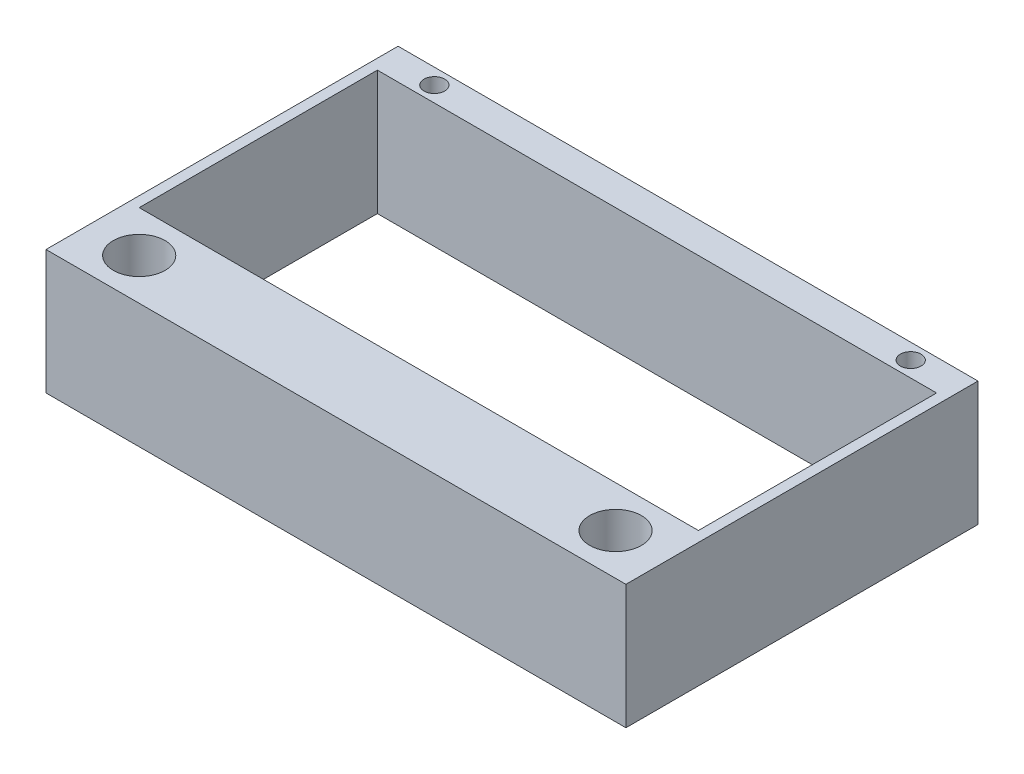
ISO-10303-21;
HEADER;
FILE_DESCRIPTION(('STEP AP214'),'2;1');
FILE_NAME('part.step','',(''),(''),'','','');
FILE_SCHEMA(('AUTOMOTIVE_DESIGN { 1 0 10303 214 1 1 1 1 }'));
ENDSEC;
DATA;
#1=APPLICATION_CONTEXT('core data for automotive mechanical design processes');
#2=APPLICATION_PROTOCOL_DEFINITION('international standard','automotive_design',2000,#1);
#3=PRODUCT_CONTEXT('',#1,'mechanical');
#4=PRODUCT('Part','Part','',(#3));
#5=PRODUCT_RELATED_PRODUCT_CATEGORY('part','',(#4));
#6=PRODUCT_DEFINITION_FORMATION('','',#4);
#7=PRODUCT_DEFINITION_CONTEXT('part definition',#1,'design');
#8=PRODUCT_DEFINITION('design','',#6,#7);
#9=PRODUCT_DEFINITION_SHAPE('','',#8);
#10=(LENGTH_UNIT() NAMED_UNIT(*) SI_UNIT(.MILLI.,.METRE.));
#11=(NAMED_UNIT(*) PLANE_ANGLE_UNIT() SI_UNIT($,.RADIAN.));
#12=(NAMED_UNIT(*) SI_UNIT($,.STERADIAN.) SOLID_ANGLE_UNIT());
#13=UNCERTAINTY_MEASURE_WITH_UNIT(LENGTH_MEASURE(1.E-05),#10,'distance_accuracy_value','');
#14=(GEOMETRIC_REPRESENTATION_CONTEXT(3) GLOBAL_UNCERTAINTY_ASSIGNED_CONTEXT((#13)) GLOBAL_UNIT_ASSIGNED_CONTEXT((#10,
#11,#12)) REPRESENTATION_CONTEXT('',''));
#15=CARTESIAN_POINT('',(0.,0.,0.));
#16=DIRECTION('',(0.,0.,1.));
#17=DIRECTION('',(1.,0.,0.));
#18=AXIS2_PLACEMENT_3D('',#15,#16,#17);
#19=CARTESIAN_POINT('',(0.,12.,0.));
#20=DIRECTION('',(0.,-1.,0.));
#21=DIRECTION('',(0.,0.,-1.));
#22=AXIS2_PLACEMENT_3D('',#19,#20,#21);
#23=PLANE('',#22);
#24=CARTESIAN_POINT('',(40.2743362831859,12.,-10.429203539823));
#25=DIRECTION('',(0.,1.,0.));
#26=DIRECTION('',(0.,0.,1.));
#27=AXIS2_PLACEMENT_3D('',#24,#25,#26);
#28=CIRCLE('',#27,0.999999999999998);
#29=CARTESIAN_POINT('',(40.2743362831859,12.,-9.42920353982301));
#30=VERTEX_POINT('',#29);
#31=EDGE_CURVE('E279',#30,#30,#28,.T.);
#32=ORIENTED_EDGE('',*,*,#31,.F.);
#33=EDGE_LOOP('',(#32));
#34=FACE_BOUND('',#33,.T.);
#35=CARTESIAN_POINT('',(-5.72566371681414,12.,-10.429203539823));
#36=DIRECTION('',(0.,1.,0.));
#37=DIRECTION('',(0.,0.,1.));
#38=AXIS2_PLACEMENT_3D('',#35,#36,#37);
#39=CIRCLE('',#38,1.);
#40=CARTESIAN_POINT('',(-5.72566371681414,12.,-9.42920353982301));
#41=VERTEX_POINT('',#40);
#42=EDGE_CURVE('E270',#41,#41,#39,.T.);
#43=ORIENTED_EDGE('',*,*,#42,.F.);
#44=EDGE_LOOP('',(#43));
#45=FACE_BOUND('',#44,.T.);
#46=CARTESIAN_POINT('',(-5.72566371681414,12.,18.070796460177));
#47=DIRECTION('',(0.,1.,0.));
#48=DIRECTION('',(0.,0.,1.));
#49=AXIS2_PLACEMENT_3D('',#46,#47,#48);
#50=CIRCLE('',#49,2.5);
#51=CARTESIAN_POINT('',(-5.72566371681414,12.,20.570796460177));
#52=VERTEX_POINT('',#51);
#53=EDGE_CURVE('E263',#52,#52,#50,.T.);
#54=ORIENTED_EDGE('',*,*,#53,.F.);
#55=EDGE_LOOP('',(#54));
#56=FACE_BOUND('',#55,.T.);
#57=CARTESIAN_POINT('',(40.2743362831859,12.,18.070796460177));
#58=DIRECTION('',(0.,1.,0.));
#59=DIRECTION('',(0.,0.,1.));
#60=AXIS2_PLACEMENT_3D('',#57,#58,#59);
#61=CIRCLE('',#60,2.5);
#62=CARTESIAN_POINT('',(40.2743362831859,12.,20.570796460177));
#63=VERTEX_POINT('',#62);
#64=EDGE_CURVE('E147',#63,#63,#61,.T.);
#65=ORIENTED_EDGE('',*,*,#64,.F.);
#66=EDGE_LOOP('',(#65));
#67=FACE_BOUND('',#66,.T.);
#68=DIRECTION('',(0.,0.,1.));
#69=VECTOR('',#68,1.);
#70=CARTESIAN_POINT('',(-10.7256637168141,12.,-1.92920353982301));
#71=LINE('',#70,#69);
#72=CARTESIAN_POINT('',(-10.7256637168141,12.,-11.929203539823));
#73=VERTEX_POINT('',#72);
#74=CARTESIAN_POINT('',(-10.7256637168142,12.,22.070796460177));
#75=VERTEX_POINT('',#74);
#76=EDGE_CURVE('E187',#73,#75,#71,.T.);
#77=ORIENTED_EDGE('',*,*,#76,.T.);
#78=DIRECTION('',(1.,0.,0.));
#79=VECTOR('',#78,1.);
#80=CARTESIAN_POINT('',(45.2743362831859,12.,22.070796460177));
#81=LINE('',#80,#79);
#82=CARTESIAN_POINT('',(45.2743362831859,12.,22.070796460177));
#83=VERTEX_POINT('',#82);
#84=EDGE_CURVE('E117',#75,#83,#81,.T.);
#85=ORIENTED_EDGE('',*,*,#84,.T.);
#86=DIRECTION('',(0.,0.,-1.));
#87=VECTOR('',#86,1.);
#88=CARTESIAN_POINT('',(45.2743362831859,12.,-9.92920353982301));
#89=LINE('',#88,#87);
#90=CARTESIAN_POINT('',(45.2743362831859,12.,-11.929203539823));
#91=VERTEX_POINT('',#90);
#92=EDGE_CURVE('E110',#83,#91,#89,.T.);
#93=ORIENTED_EDGE('',*,*,#92,.T.);
#94=DIRECTION('',(-1.,0.,0.));
#95=VECTOR('',#94,1.);
#96=CARTESIAN_POINT('',(-10.7256637168141,12.,-11.929203539823));
#97=LINE('',#96,#95);
#98=EDGE_CURVE('E114',#91,#73,#97,.T.);
#99=ORIENTED_EDGE('',*,*,#98,.T.);
#100=EDGE_LOOP('',(#77,#85,#93,#99));
#101=FACE_BOUND('',#100,.T.);
#102=DIRECTION('',(1.,0.,0.));
#103=VECTOR('',#102,1.);
#104=CARTESIAN_POINT('',(-9.72566371681414,12.,14.070796460177));
#105=LINE('',#104,#103);
#106=CARTESIAN_POINT('',(-9.72566371681414,12.,14.070796460177));
#107=VERTEX_POINT('',#106);
#108=CARTESIAN_POINT('',(44.2743362831859,12.,14.070796460177));
#109=VERTEX_POINT('',#108);
#110=EDGE_CURVE('E150',#107,#109,#105,.T.);
#111=ORIENTED_EDGE('',*,*,#110,.F.);
#112=DIRECTION('',(0.,0.,1.));
#113=VECTOR('',#112,1.);
#114=CARTESIAN_POINT('',(-9.72566371681415,12.,-8.92920353982301));
#115=LINE('',#114,#113);
#116=CARTESIAN_POINT('',(-9.72566371681418,12.,-8.92920353982301));
#117=VERTEX_POINT('',#116);
#118=EDGE_CURVE('E159',#117,#107,#115,.T.);
#119=ORIENTED_EDGE('',*,*,#118,.F.);
#120=DIRECTION('',(-1.,0.,0.));
#121=VECTOR('',#120,1.);
#122=CARTESIAN_POINT('',(44.2743362831858,12.,-8.92920353982301));
#123=LINE('',#122,#121);
#124=CARTESIAN_POINT('',(44.2743362831858,12.,-8.92920353982301));
#125=VERTEX_POINT('',#124);
#126=EDGE_CURVE('E156',#125,#117,#123,.T.);
#127=ORIENTED_EDGE('',*,*,#126,.F.);
#128=DIRECTION('',(0.,0.,-1.));
#129=VECTOR('',#128,1.);
#130=CARTESIAN_POINT('',(44.2743362831859,12.,14.070796460177));
#131=LINE('',#130,#129);
#132=EDGE_CURVE('E152',#109,#125,#131,.T.);
#133=ORIENTED_EDGE('',*,*,#132,.F.);
#134=EDGE_LOOP('',(#111,#119,#127,#133));
#135=FACE_BOUND('',#134,.T.);
#136=ADVANCED_FACE('F42',(#34,#45,#56,#67,#101,#135),#23,.F.);
#137=CARTESIAN_POINT('',(0.,0.,0.));
#138=DIRECTION('',(0.,-1.,0.));
#139=DIRECTION('',(0.,0.,-1.));
#140=AXIS2_PLACEMENT_3D('',#137,#138,#139);
#141=PLANE('',#140);
#142=CARTESIAN_POINT('',(40.2743362831859,0.,-10.429203539823));
#143=DIRECTION('',(0.,1.,0.));
#144=DIRECTION('',(0.,0.,1.));
#145=AXIS2_PLACEMENT_3D('',#142,#143,#144);
#146=CIRCLE('',#145,0.999999999999998);
#147=CARTESIAN_POINT('',(40.2743362831859,0.,-9.42920353982301));
#148=VERTEX_POINT('',#147);
#149=EDGE_CURVE('E283',#148,#148,#146,.T.);
#150=ORIENTED_EDGE('',*,*,#149,.T.);
#151=EDGE_LOOP('',(#150));
#152=FACE_BOUND('',#151,.T.);
#153=CARTESIAN_POINT('',(-5.72566371681414,0.,-10.429203539823));
#154=DIRECTION('',(0.,1.,0.));
#155=DIRECTION('',(0.,0.,1.));
#156=AXIS2_PLACEMENT_3D('',#153,#154,#155);
#157=CIRCLE('',#156,1.);
#158=CARTESIAN_POINT('',(-5.72566371681414,0.,-9.42920353982301));
#159=VERTEX_POINT('',#158);
#160=EDGE_CURVE('E276',#159,#159,#157,.T.);
#161=ORIENTED_EDGE('',*,*,#160,.T.);
#162=EDGE_LOOP('',(#161));
#163=FACE_BOUND('',#162,.T.);
#164=CARTESIAN_POINT('',(-5.72566371681414,0.,18.070796460177));
#165=DIRECTION('',(0.,1.,0.));
#166=DIRECTION('',(0.,0.,1.));
#167=AXIS2_PLACEMENT_3D('',#164,#165,#166);
#168=CIRCLE('',#167,2.5);
#169=CARTESIAN_POINT('',(-5.72566371681414,0.,20.570796460177));
#170=VERTEX_POINT('',#169);
#171=EDGE_CURVE('E260',#170,#170,#168,.T.);
#172=ORIENTED_EDGE('',*,*,#171,.T.);
#173=EDGE_LOOP('',(#172));
#174=FACE_BOUND('',#173,.T.);
#175=CARTESIAN_POINT('',(40.2743362831859,0.,18.070796460177));
#176=DIRECTION('',(0.,1.,0.));
#177=DIRECTION('',(0.,0.,1.));
#178=AXIS2_PLACEMENT_3D('',#175,#176,#177);
#179=CIRCLE('',#178,2.5);
#180=CARTESIAN_POINT('',(40.2743362831859,0.,20.570796460177));
#181=VERTEX_POINT('',#180);
#182=EDGE_CURVE('E144',#181,#181,#179,.T.);
#183=ORIENTED_EDGE('',*,*,#182,.T.);
#184=EDGE_LOOP('',(#183));
#185=FACE_BOUND('',#184,.T.);
#186=DIRECTION('',(0.,0.,1.));
#187=VECTOR('',#186,1.);
#188=CARTESIAN_POINT('',(-10.7256637168142,0.,22.070796460177));
#189=LINE('',#188,#187);
#190=CARTESIAN_POINT('',(-10.7256637168141,0.,-11.929203539823));
#191=VERTEX_POINT('',#190);
#192=CARTESIAN_POINT('',(-10.7256637168142,0.,22.070796460177));
#193=VERTEX_POINT('',#192);
#194=EDGE_CURVE('E186',#191,#193,#189,.T.);
#195=ORIENTED_EDGE('',*,*,#194,.F.);
#196=DIRECTION('',(-1.,0.,0.));
#197=VECTOR('',#196,1.);
#198=CARTESIAN_POINT('',(-10.7256637168141,0.,-11.929203539823));
#199=LINE('',#198,#197);
#200=CARTESIAN_POINT('',(45.2743362831859,0.,-11.929203539823));
#201=VERTEX_POINT('',#200);
#202=EDGE_CURVE('E137',#201,#191,#199,.T.);
#203=ORIENTED_EDGE('',*,*,#202,.F.);
#204=DIRECTION('',(0.,0.,-1.));
#205=VECTOR('',#204,1.);
#206=CARTESIAN_POINT('',(45.2743362831859,0.,-9.92920353982301));
#207=LINE('',#206,#205);
#208=CARTESIAN_POINT('',(45.2743362831859,0.,22.070796460177));
#209=VERTEX_POINT('',#208);
#210=EDGE_CURVE('E127',#209,#201,#207,.T.);
#211=ORIENTED_EDGE('',*,*,#210,.F.);
#212=DIRECTION('',(1.,0.,0.));
#213=VECTOR('',#212,1.);
#214=CARTESIAN_POINT('',(45.2743362831859,0.,22.070796460177));
#215=LINE('',#214,#213);
#216=EDGE_CURVE('E194',#193,#209,#215,.T.);
#217=ORIENTED_EDGE('',*,*,#216,.F.);
#218=EDGE_LOOP('',(#195,#203,#211,#217));
#219=FACE_BOUND('',#218,.T.);
#220=DIRECTION('',(0.,0.,1.));
#221=VECTOR('',#220,1.);
#222=CARTESIAN_POINT('',(-9.72566371681415,0.,7.070796460177));
#223=LINE('',#222,#221);
#224=CARTESIAN_POINT('',(-9.72566371681415,0.,-8.92920353982301));
#225=VERTEX_POINT('',#224);
#226=CARTESIAN_POINT('',(-9.72566371681414,0.,14.070796460177));
#227=VERTEX_POINT('',#226);
#228=EDGE_CURVE('E153',#225,#227,#223,.T.);
#229=ORIENTED_EDGE('',*,*,#228,.T.);
#230=DIRECTION('',(1.,0.,0.));
#231=VECTOR('',#230,1.);
#232=CARTESIAN_POINT('',(-9.72566371681414,0.,14.070796460177));
#233=LINE('',#232,#231);
#234=CARTESIAN_POINT('',(44.2743362831859,0.,14.070796460177));
#235=VERTEX_POINT('',#234);
#236=EDGE_CURVE('E66',#227,#235,#233,.T.);
#237=ORIENTED_EDGE('',*,*,#236,.T.);
#238=DIRECTION('',(0.,0.,-1.));
#239=VECTOR('',#238,1.);
#240=CARTESIAN_POINT('',(44.2743362831859,0.,14.070796460177));
#241=LINE('',#240,#239);
#242=CARTESIAN_POINT('',(44.2743362831858,0.,-8.92920353982301));
#243=VERTEX_POINT('',#242);
#244=EDGE_CURVE('E165',#235,#243,#241,.T.);
#245=ORIENTED_EDGE('',*,*,#244,.T.);
#246=DIRECTION('',(-1.,0.,0.));
#247=VECTOR('',#246,1.);
#248=CARTESIAN_POINT('',(44.2743362831858,0.,-8.92920353982301));
#249=LINE('',#248,#247);
#250=EDGE_CURVE('E169',#243,#225,#249,.T.);
#251=ORIENTED_EDGE('',*,*,#250,.T.);
#252=EDGE_LOOP('',(#229,#237,#245,#251));
#253=FACE_BOUND('',#252,.T.);
#254=ADVANCED_FACE('F202',(#152,#163,#174,#185,#219,#253),#141,.T.);
#255=CARTESIAN_POINT('',(-10.7256637168142,12.,22.070796460177));
#256=DIRECTION('',(1.,0.,0.));
#257=DIRECTION('',(0.,0.,-1.));
#258=AXIS2_PLACEMENT_3D('',#255,#256,#257);
#259=PLANE('',#258);
#260=ORIENTED_EDGE('',*,*,#194,.T.);
#261=DIRECTION('',(0.,-1.,0.));
#262=VECTOR('',#261,1.);
#263=CARTESIAN_POINT('',(-10.7256637168142,12.,22.070796460177));
#264=LINE('',#263,#262);
#265=EDGE_CURVE('E11',#75,#193,#264,.T.);
#266=ORIENTED_EDGE('',*,*,#265,.F.);
#267=ORIENTED_EDGE('',*,*,#76,.F.);
#268=DIRECTION('',(0.,-1.,0.));
#269=VECTOR('',#268,1.);
#270=CARTESIAN_POINT('',(-10.7256637168141,12.,-11.929203539823));
#271=LINE('',#270,#269);
#272=EDGE_CURVE('E132',#73,#191,#271,.T.);
#273=ORIENTED_EDGE('',*,*,#272,.T.);
#274=EDGE_LOOP('',(#260,#266,#267,#273));
#275=FACE_BOUND('',#274,.T.);
#276=ADVANCED_FACE('F44',(#275),#259,.F.);
#277=CARTESIAN_POINT('',(45.2743362831859,12.,22.070796460177));
#278=DIRECTION('',(0.,0.,-1.));
#279=DIRECTION('',(-1.,0.,0.));
#280=AXIS2_PLACEMENT_3D('',#277,#278,#279);
#281=PLANE('',#280);
#282=ORIENTED_EDGE('',*,*,#216,.T.);
#283=DIRECTION('',(0.,-1.,0.));
#284=VECTOR('',#283,1.);
#285=CARTESIAN_POINT('',(45.2743362831859,12.,22.070796460177));
#286=LINE('',#285,#284);
#287=EDGE_CURVE('E51',#83,#209,#286,.T.);
#288=ORIENTED_EDGE('',*,*,#287,.F.);
#289=ORIENTED_EDGE('',*,*,#84,.F.);
#290=ORIENTED_EDGE('',*,*,#265,.T.);
#291=EDGE_LOOP('',(#282,#288,#289,#290));
#292=FACE_BOUND('',#291,.T.);
#293=ADVANCED_FACE('F206',(#292),#281,.F.);
#294=CARTESIAN_POINT('',(45.2743362831859,12.,-9.92920353982301));
#295=DIRECTION('',(-1.,0.,0.));
#296=DIRECTION('',(0.,0.,1.));
#297=AXIS2_PLACEMENT_3D('',#294,#295,#296);
#298=PLANE('',#297);
#299=ORIENTED_EDGE('',*,*,#210,.T.);
#300=DIRECTION('',(0.,-1.,0.));
#301=VECTOR('',#300,1.);
#302=CARTESIAN_POINT('',(45.2743362831859,12.,-11.929203539823));
#303=LINE('',#302,#301);
#304=EDGE_CURVE('E124',#91,#201,#303,.T.);
#305=ORIENTED_EDGE('',*,*,#304,.F.);
#306=ORIENTED_EDGE('',*,*,#92,.F.);
#307=ORIENTED_EDGE('',*,*,#287,.T.);
#308=EDGE_LOOP('',(#299,#305,#306,#307));
#309=FACE_BOUND('',#308,.T.);
#310=ADVANCED_FACE('F125',(#309),#298,.F.);
#311=CARTESIAN_POINT('',(-9.72566371681414,12.,14.070796460177));
#312=DIRECTION('',(0.,0.,-1.));
#313=DIRECTION('',(-1.,0.,0.));
#314=AXIS2_PLACEMENT_3D('',#311,#312,#313);
#315=PLANE('',#314);
#316=ORIENTED_EDGE('',*,*,#236,.F.);
#317=DIRECTION('',(0.,-1.,0.));
#318=VECTOR('',#317,1.);
#319=CARTESIAN_POINT('',(-9.72566371681414,12.,14.070796460177));
#320=LINE('',#319,#318);
#321=EDGE_CURVE('E162',#107,#227,#320,.T.);
#322=ORIENTED_EDGE('',*,*,#321,.F.);
#323=ORIENTED_EDGE('',*,*,#110,.T.);
#324=DIRECTION('',(0.,-1.,0.));
#325=VECTOR('',#324,1.);
#326=CARTESIAN_POINT('',(44.2743362831859,12.,14.070796460177));
#327=LINE('',#326,#325);
#328=EDGE_CURVE('E183',#109,#235,#327,.T.);
#329=ORIENTED_EDGE('',*,*,#328,.T.);
#330=EDGE_LOOP('',(#316,#322,#323,#329));
#331=FACE_BOUND('',#330,.T.);
#332=ADVANCED_FACE('F212',(#331),#315,.T.);
#333=CARTESIAN_POINT('',(44.2743362831859,12.,14.070796460177));
#334=DIRECTION('',(-1.,0.,0.));
#335=DIRECTION('',(0.,0.,1.));
#336=AXIS2_PLACEMENT_3D('',#333,#334,#335);
#337=PLANE('',#336);
#338=ORIENTED_EDGE('',*,*,#244,.F.);
#339=ORIENTED_EDGE('',*,*,#328,.F.);
#340=ORIENTED_EDGE('',*,*,#132,.T.);
#341=DIRECTION('',(0.,-1.,0.));
#342=VECTOR('',#341,1.);
#343=CARTESIAN_POINT('',(44.2743362831858,12.,-8.92920353982301));
#344=LINE('',#343,#342);
#345=EDGE_CURVE('E180',#125,#243,#344,.T.);
#346=ORIENTED_EDGE('',*,*,#345,.T.);
#347=EDGE_LOOP('',(#338,#339,#340,#346));
#348=FACE_BOUND('',#347,.T.);
#349=ADVANCED_FACE('F227',(#348),#337,.T.);
#350=CARTESIAN_POINT('',(44.2743362831858,12.,-8.92920353982301));
#351=DIRECTION('',(0.,0.,1.));
#352=DIRECTION('',(1.,0.,0.));
#353=AXIS2_PLACEMENT_3D('',#350,#351,#352);
#354=PLANE('',#353);
#355=ORIENTED_EDGE('',*,*,#250,.F.);
#356=ORIENTED_EDGE('',*,*,#345,.F.);
#357=ORIENTED_EDGE('',*,*,#126,.T.);
#358=DIRECTION('',(0.,-1.,0.));
#359=VECTOR('',#358,1.);
#360=CARTESIAN_POINT('',(-9.72566371681415,12.,-8.92920353982301));
#361=LINE('',#360,#359);
#362=EDGE_CURVE('E58',#117,#225,#361,.T.);
#363=ORIENTED_EDGE('',*,*,#362,.T.);
#364=EDGE_LOOP('',(#355,#356,#357,#363));
#365=FACE_BOUND('',#364,.T.);
#366=ADVANCED_FACE('F230',(#365),#354,.T.);
#367=CARTESIAN_POINT('',(-9.72566371681415,12.,7.070796460177));
#368=DIRECTION('',(1.,0.,0.));
#369=DIRECTION('',(0.,0.,-1.));
#370=AXIS2_PLACEMENT_3D('',#367,#368,#369);
#371=PLANE('',#370);
#372=ORIENTED_EDGE('',*,*,#228,.F.);
#373=ORIENTED_EDGE('',*,*,#362,.F.);
#374=ORIENTED_EDGE('',*,*,#118,.T.);
#375=ORIENTED_EDGE('',*,*,#321,.T.);
#376=EDGE_LOOP('',(#372,#373,#374,#375));
#377=FACE_BOUND('',#376,.T.);
#378=ADVANCED_FACE('F234',(#377),#371,.T.);
#379=CARTESIAN_POINT('',(-10.7256637168141,12.,-11.929203539823));
#380=DIRECTION('',(0.,0.,1.));
#381=DIRECTION('',(1.,0.,0.));
#382=AXIS2_PLACEMENT_3D('',#379,#380,#381);
#383=PLANE('',#382);
#384=ORIENTED_EDGE('',*,*,#202,.T.);
#385=ORIENTED_EDGE('',*,*,#272,.F.);
#386=ORIENTED_EDGE('',*,*,#98,.F.);
#387=ORIENTED_EDGE('',*,*,#304,.T.);
#388=EDGE_LOOP('',(#384,#385,#386,#387));
#389=FACE_BOUND('',#388,.T.);
#390=ADVANCED_FACE('F134',(#389),#383,.F.);
#391=CARTESIAN_POINT('',(40.2743362831859,0.,18.070796460177));
#392=DIRECTION('',(0.,1.,0.));
#393=DIRECTION('',(0.,0.,1.));
#394=AXIS2_PLACEMENT_3D('',#391,#392,#393);
#395=CYLINDRICAL_SURFACE('',#394,2.5);
#396=ORIENTED_EDGE('',*,*,#182,.F.);
#397=EDGE_LOOP('',(#396));
#398=FACE_BOUND('',#397,.T.);
#399=ORIENTED_EDGE('',*,*,#64,.T.);
#400=EDGE_LOOP('',(#399));
#401=FACE_BOUND('',#400,.T.);
#402=ADVANCED_FACE('F240',(#398,#401),#395,.F.);
#403=CARTESIAN_POINT('',(-5.72566371681414,0.,18.070796460177));
#404=DIRECTION('',(0.,1.,0.));
#405=DIRECTION('',(0.,0.,1.));
#406=AXIS2_PLACEMENT_3D('',#403,#404,#405);
#407=CYLINDRICAL_SURFACE('',#406,2.5);
#408=ORIENTED_EDGE('',*,*,#171,.F.);
#409=EDGE_LOOP('',(#408));
#410=FACE_BOUND('',#409,.T.);
#411=ORIENTED_EDGE('',*,*,#53,.T.);
#412=EDGE_LOOP('',(#411));
#413=FACE_BOUND('',#412,.T.);
#414=ADVANCED_FACE('F243',(#410,#413),#407,.F.);
#415=CARTESIAN_POINT('',(-5.72566371681414,0.,-10.429203539823));
#416=DIRECTION('',(0.,1.,0.));
#417=DIRECTION('',(0.,0.,1.));
#418=AXIS2_PLACEMENT_3D('',#415,#416,#417);
#419=CYLINDRICAL_SURFACE('',#418,1.);
#420=ORIENTED_EDGE('',*,*,#160,.F.);
#421=EDGE_LOOP('',(#420));
#422=FACE_BOUND('',#421,.T.);
#423=ORIENTED_EDGE('',*,*,#42,.T.);
#424=EDGE_LOOP('',(#423));
#425=FACE_BOUND('',#424,.T.);
#426=ADVANCED_FACE('F248',(#422,#425),#419,.F.);
#427=CARTESIAN_POINT('',(40.2743362831859,0.,-10.429203539823));
#428=DIRECTION('',(0.,1.,0.));
#429=DIRECTION('',(0.,0.,1.));
#430=AXIS2_PLACEMENT_3D('',#427,#428,#429);
#431=CYLINDRICAL_SURFACE('',#430,0.999999999999998);
#432=ORIENTED_EDGE('',*,*,#149,.F.);
#433=EDGE_LOOP('',(#432));
#434=FACE_BOUND('',#433,.T.);
#435=ORIENTED_EDGE('',*,*,#31,.T.);
#436=EDGE_LOOP('',(#435));
#437=FACE_BOUND('',#436,.T.);
#438=ADVANCED_FACE('F245',(#434,#437),#431,.F.);
#439=CLOSED_SHELL('',(#136,#254,#276,#293,#310,#332,#349,#366,#378,#390,#402,#414,#426,#438));
#440=MANIFOLD_SOLID_BREP('B2',#439);
#441=ADVANCED_BREP_SHAPE_REPRESENTATION('',(#18,#440),#14);
#442=SHAPE_DEFINITION_REPRESENTATION(#9,#441);
ENDSEC;
END-ISO-10303-21;
